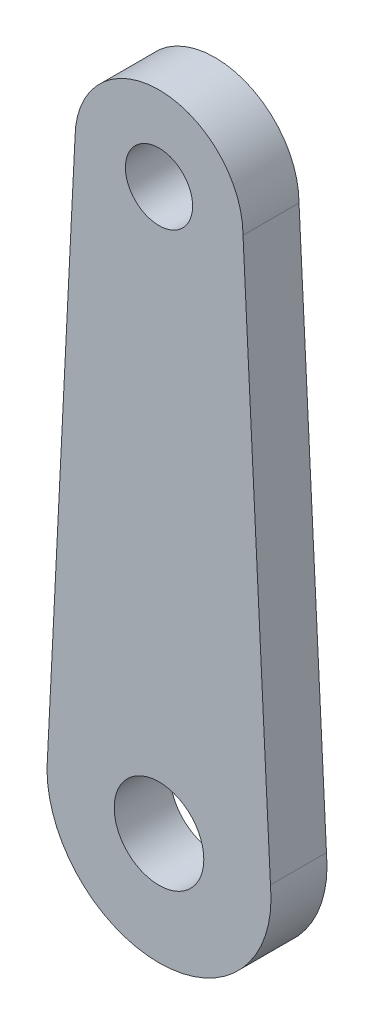
ISO-10303-21;
HEADER;
FILE_DESCRIPTION(('STEP AP214'),'2;1');
FILE_NAME('part.step','',(''),(''),'','','');
FILE_SCHEMA(('AUTOMOTIVE_DESIGN { 1 0 10303 214 1 1 1 1 }'));
ENDSEC;
DATA;
#1=APPLICATION_CONTEXT('core data for automotive mechanical design processes');
#2=APPLICATION_PROTOCOL_DEFINITION('international standard','automotive_design',2000,#1);
#3=PRODUCT_CONTEXT('',#1,'mechanical');
#4=PRODUCT('Part','Part','',(#3));
#5=PRODUCT_RELATED_PRODUCT_CATEGORY('part','',(#4));
#6=PRODUCT_DEFINITION_FORMATION('','',#4);
#7=PRODUCT_DEFINITION_CONTEXT('part definition',#1,'design');
#8=PRODUCT_DEFINITION('design','',#6,#7);
#9=PRODUCT_DEFINITION_SHAPE('','',#8);
#10=(LENGTH_UNIT() NAMED_UNIT(*) SI_UNIT(.MILLI.,.METRE.));
#11=(NAMED_UNIT(*) PLANE_ANGLE_UNIT() SI_UNIT($,.RADIAN.));
#12=(NAMED_UNIT(*) SI_UNIT($,.STERADIAN.) SOLID_ANGLE_UNIT());
#13=UNCERTAINTY_MEASURE_WITH_UNIT(LENGTH_MEASURE(1.E-05),#10,'distance_accuracy_value','');
#14=(GEOMETRIC_REPRESENTATION_CONTEXT(3) GLOBAL_UNCERTAINTY_ASSIGNED_CONTEXT((#13)) GLOBAL_UNIT_ASSIGNED_CONTEXT((#10,
#11,#12)) REPRESENTATION_CONTEXT('',''));
#15=CARTESIAN_POINT('',(0.,0.,0.));
#16=DIRECTION('',(0.,0.,1.));
#17=DIRECTION('',(1.,0.,0.));
#18=AXIS2_PLACEMENT_3D('',#15,#16,#17);
#19=CARTESIAN_POINT('',(0.,0.,5.));
#20=DIRECTION('',(0.,0.,1.));
#21=DIRECTION('',(1.,0.,0.));
#22=AXIS2_PLACEMENT_3D('',#19,#20,#21);
#23=PLANE('',#22);
#24=CARTESIAN_POINT('',(0.,0.,5.));
#25=DIRECTION('',(0.,0.,1.));
#26=DIRECTION('',(1.,0.,0.));
#27=AXIS2_PLACEMENT_3D('',#24,#25,#26);
#28=CIRCLE('',#27,4.);
#29=CARTESIAN_POINT('',(4.,0.,5.));
#30=VERTEX_POINT('',#29);
#31=EDGE_CURVE('E98',#30,#30,#28,.T.);
#32=ORIENTED_EDGE('',*,*,#31,.F.);
#33=EDGE_LOOP('',(#32));
#34=FACE_BOUND('',#33,.T.);
#35=CARTESIAN_POINT('',(0.,0.,5.));
#36=DIRECTION('',(0.,0.,1.));
#37=DIRECTION('',(1.,0.,0.));
#38=AXIS2_PLACEMENT_3D('',#35,#36,#37);
#39=CIRCLE('',#38,10.);
#40=CARTESIAN_POINT('',(-9.9501246882793,0.997506234414005,5.));
#41=VERTEX_POINT('',#40);
#42=CARTESIAN_POINT('',(9.9501246882793,0.997506234414005,5.));
#43=VERTEX_POINT('',#42);
#44=EDGE_CURVE('E83',#41,#43,#39,.T.);
#45=ORIENTED_EDGE('',*,*,#44,.T.);
#46=DIRECTION('',(-0.0499376169438923,0.998752338877845,0.));
#47=VECTOR('',#46,1.);
#48=CARTESIAN_POINT('',(7.49999999999999,50.,5.));
#49=LINE('',#48,#47);
#50=CARTESIAN_POINT('',(7.49999999999999,50.,5.));
#51=VERTEX_POINT('',#50);
#52=EDGE_CURVE('E78',#43,#51,#49,.T.);
#53=ORIENTED_EDGE('',*,*,#52,.T.);
#54=CARTESIAN_POINT('',(0.,50.,5.));
#55=DIRECTION('',(0.,0.,1.));
#56=DIRECTION('',(1.,0.,0.));
#57=AXIS2_PLACEMENT_3D('',#54,#55,#56);
#58=CIRCLE('',#57,7.49999999999999);
#59=CARTESIAN_POINT('',(-7.49999999999999,50.,5.));
#60=VERTEX_POINT('',#59);
#61=EDGE_CURVE('E81',#51,#60,#58,.T.);
#62=ORIENTED_EDGE('',*,*,#61,.T.);
#63=DIRECTION('',(-0.0499376169438923,-0.998752338877845,0.));
#64=VECTOR('',#63,1.);
#65=CARTESIAN_POINT('',(-7.49999999999999,50.,5.));
#66=LINE('',#65,#64);
#67=EDGE_CURVE('E48',#60,#41,#66,.T.);
#68=ORIENTED_EDGE('',*,*,#67,.T.);
#69=EDGE_LOOP('',(#45,#53,#62,#68));
#70=FACE_BOUND('',#69,.T.);
#71=CARTESIAN_POINT('',(0.,50.,5.));
#72=DIRECTION('',(0.,0.,1.));
#73=DIRECTION('',(1.,0.,0.));
#74=AXIS2_PLACEMENT_3D('',#71,#72,#73);
#75=CIRCLE('',#74,3.);
#76=CARTESIAN_POINT('',(3.,50.,5.));
#77=VERTEX_POINT('',#76);
#78=EDGE_CURVE('E113',#77,#77,#75,.T.);
#79=ORIENTED_EDGE('',*,*,#78,.F.);
#80=EDGE_LOOP('',(#79));
#81=FACE_BOUND('',#80,.T.);
#82=ADVANCED_FACE('F31',(#34,#70,#81),#23,.T.);
#83=CARTESIAN_POINT('',(0.,0.,0.));
#84=DIRECTION('',(0.,0.,1.));
#85=DIRECTION('',(1.,0.,0.));
#86=AXIS2_PLACEMENT_3D('',#83,#84,#85);
#87=PLANE('',#86);
#88=CARTESIAN_POINT('',(0.,0.,0.));
#89=DIRECTION('',(0.,0.,1.));
#90=DIRECTION('',(1.,0.,0.));
#91=AXIS2_PLACEMENT_3D('',#88,#89,#90);
#92=CIRCLE('',#91,4.);
#93=CARTESIAN_POINT('',(4.,0.,0.));
#94=VERTEX_POINT('',#93);
#95=EDGE_CURVE('E110',#94,#94,#92,.T.);
#96=ORIENTED_EDGE('',*,*,#95,.T.);
#97=EDGE_LOOP('',(#96));
#98=FACE_BOUND('',#97,.T.);
#99=CARTESIAN_POINT('',(0.,0.,0.));
#100=DIRECTION('',(0.,0.,1.));
#101=DIRECTION('',(1.,0.,0.));
#102=AXIS2_PLACEMENT_3D('',#99,#100,#101);
#103=CIRCLE('',#102,10.);
#104=CARTESIAN_POINT('',(-9.9501246882793,0.997506234414005,0.));
#105=VERTEX_POINT('',#104);
#106=CARTESIAN_POINT('',(9.9501246882793,0.997506234414005,0.));
#107=VERTEX_POINT('',#106);
#108=EDGE_CURVE('E95',#105,#107,#103,.T.);
#109=ORIENTED_EDGE('',*,*,#108,.F.);
#110=DIRECTION('',(-0.0499376169438923,-0.998752338877845,0.));
#111=VECTOR('',#110,1.);
#112=CARTESIAN_POINT('',(-7.49999999999999,50.,0.));
#113=LINE('',#112,#111);
#114=CARTESIAN_POINT('',(-7.49999999999999,50.,0.));
#115=VERTEX_POINT('',#114);
#116=EDGE_CURVE('E71',#115,#105,#113,.T.);
#117=ORIENTED_EDGE('',*,*,#116,.F.);
#118=CARTESIAN_POINT('',(0.,50.,0.));
#119=DIRECTION('',(0.,0.,1.));
#120=DIRECTION('',(1.,0.,0.));
#121=AXIS2_PLACEMENT_3D('',#118,#119,#120);
#122=CIRCLE('',#121,7.49999999999999);
#123=CARTESIAN_POINT('',(7.49999999999999,50.,0.));
#124=VERTEX_POINT('',#123);
#125=EDGE_CURVE('E65',#124,#115,#122,.T.);
#126=ORIENTED_EDGE('',*,*,#125,.F.);
#127=DIRECTION('',(-0.0499376169438923,0.998752338877845,0.));
#128=VECTOR('',#127,1.);
#129=CARTESIAN_POINT('',(7.49999999999999,50.,0.));
#130=LINE('',#129,#128);
#131=EDGE_CURVE('E87',#107,#124,#130,.T.);
#132=ORIENTED_EDGE('',*,*,#131,.F.);
#133=EDGE_LOOP('',(#109,#117,#126,#132));
#134=FACE_BOUND('',#133,.T.);
#135=CARTESIAN_POINT('',(0.,50.,0.));
#136=DIRECTION('',(0.,0.,1.));
#137=DIRECTION('',(1.,0.,0.));
#138=AXIS2_PLACEMENT_3D('',#135,#136,#137);
#139=CIRCLE('',#138,3.);
#140=CARTESIAN_POINT('',(3.,50.,0.));
#141=VERTEX_POINT('',#140);
#142=EDGE_CURVE('E116',#141,#141,#139,.T.);
#143=ORIENTED_EDGE('',*,*,#142,.T.);
#144=EDGE_LOOP('',(#143));
#145=FACE_BOUND('',#144,.T.);
#146=ADVANCED_FACE('F106',(#98,#134,#145),#87,.F.);
#147=CARTESIAN_POINT('',(0.,0.,5.));
#148=DIRECTION('',(0.,0.,-1.));
#149=DIRECTION('',(-1.,0.,0.));
#150=AXIS2_PLACEMENT_3D('',#147,#148,#149);
#151=CYLINDRICAL_SURFACE('',#150,10.);
#152=ORIENTED_EDGE('',*,*,#108,.T.);
#153=DIRECTION('',(0.,0.,-1.));
#154=VECTOR('',#153,1.);
#155=CARTESIAN_POINT('',(9.9501246882793,0.997506234414005,5.));
#156=LINE('',#155,#154);
#157=EDGE_CURVE('E11',#43,#107,#156,.T.);
#158=ORIENTED_EDGE('',*,*,#157,.F.);
#159=ORIENTED_EDGE('',*,*,#44,.F.);
#160=DIRECTION('',(0.,0.,-1.));
#161=VECTOR('',#160,1.);
#162=CARTESIAN_POINT('',(-9.9501246882793,0.997506234414005,5.));
#163=LINE('',#162,#161);
#164=EDGE_CURVE('E91',#41,#105,#163,.T.);
#165=ORIENTED_EDGE('',*,*,#164,.T.);
#166=EDGE_LOOP('',(#152,#158,#159,#165));
#167=FACE_BOUND('',#166,.T.);
#168=ADVANCED_FACE('F33',(#167),#151,.T.);
#169=CARTESIAN_POINT('',(7.49999999999999,50.,5.));
#170=DIRECTION('',(-0.998752338877845,-0.0499376169438923,0.));
#171=DIRECTION('',(0.0499376169438923,-0.998752338877845,0.));
#172=AXIS2_PLACEMENT_3D('',#169,#170,#171);
#173=PLANE('',#172);
#174=ORIENTED_EDGE('',*,*,#131,.T.);
#175=DIRECTION('',(0.,0.,-1.));
#176=VECTOR('',#175,1.);
#177=CARTESIAN_POINT('',(7.49999999999999,50.,5.));
#178=LINE('',#177,#176);
#179=EDGE_CURVE('E40',#51,#124,#178,.T.);
#180=ORIENTED_EDGE('',*,*,#179,.F.);
#181=ORIENTED_EDGE('',*,*,#52,.F.);
#182=ORIENTED_EDGE('',*,*,#157,.T.);
#183=EDGE_LOOP('',(#174,#180,#181,#182));
#184=FACE_BOUND('',#183,.T.);
#185=ADVANCED_FACE('F86',(#184),#173,.F.);
#186=CARTESIAN_POINT('',(0.,50.,5.));
#187=DIRECTION('',(0.,0.,-1.));
#188=DIRECTION('',(-1.,0.,0.));
#189=AXIS2_PLACEMENT_3D('',#186,#187,#188);
#190=CYLINDRICAL_SURFACE('',#189,7.49999999999999);
#191=ORIENTED_EDGE('',*,*,#125,.T.);
#192=DIRECTION('',(0.,0.,-1.));
#193=VECTOR('',#192,1.);
#194=CARTESIAN_POINT('',(-7.49999999999999,50.,5.));
#195=LINE('',#194,#193);
#196=EDGE_CURVE('E88',#60,#115,#195,.T.);
#197=ORIENTED_EDGE('',*,*,#196,.F.);
#198=ORIENTED_EDGE('',*,*,#61,.F.);
#199=ORIENTED_EDGE('',*,*,#179,.T.);
#200=EDGE_LOOP('',(#191,#197,#198,#199));
#201=FACE_BOUND('',#200,.T.);
#202=ADVANCED_FACE('F89',(#201),#190,.T.);
#203=CARTESIAN_POINT('',(-7.49999999999999,50.,5.));
#204=DIRECTION('',(0.998752338877845,-0.0499376169438923,0.));
#205=DIRECTION('',(0.0499376169438923,0.998752338877845,0.));
#206=AXIS2_PLACEMENT_3D('',#203,#204,#205);
#207=PLANE('',#206);
#208=ORIENTED_EDGE('',*,*,#116,.T.);
#209=ORIENTED_EDGE('',*,*,#164,.F.);
#210=ORIENTED_EDGE('',*,*,#67,.F.);
#211=ORIENTED_EDGE('',*,*,#196,.T.);
#212=EDGE_LOOP('',(#208,#209,#210,#211));
#213=FACE_BOUND('',#212,.T.);
#214=ADVANCED_FACE('F103',(#213),#207,.F.);
#215=CARTESIAN_POINT('',(0.,0.,5.));
#216=DIRECTION('',(0.,0.,-1.));
#217=DIRECTION('',(-1.,0.,0.));
#218=AXIS2_PLACEMENT_3D('',#215,#216,#217);
#219=CYLINDRICAL_SURFACE('',#218,4.);
#220=ORIENTED_EDGE('',*,*,#31,.T.);
#221=EDGE_LOOP('',(#220));
#222=FACE_BOUND('',#221,.T.);
#223=ORIENTED_EDGE('',*,*,#95,.F.);
#224=EDGE_LOOP('',(#223));
#225=FACE_BOUND('',#224,.T.);
#226=ADVANCED_FACE('F134',(#222,#225),#219,.F.);
#227=CARTESIAN_POINT('',(0.,50.,5.));
#228=DIRECTION('',(0.,0.,-1.));
#229=DIRECTION('',(-1.,0.,0.));
#230=AXIS2_PLACEMENT_3D('',#227,#228,#229);
#231=CYLINDRICAL_SURFACE('',#230,3.);
#232=ORIENTED_EDGE('',*,*,#78,.T.);
#233=EDGE_LOOP('',(#232));
#234=FACE_BOUND('',#233,.T.);
#235=ORIENTED_EDGE('',*,*,#142,.F.);
#236=EDGE_LOOP('',(#235));
#237=FACE_BOUND('',#236,.T.);
#238=ADVANCED_FACE('F122',(#234,#237),#231,.F.);
#239=CLOSED_SHELL('',(#82,#146,#168,#185,#202,#214,#226,#238));
#240=MANIFOLD_SOLID_BREP('B2',#239);
#241=ADVANCED_BREP_SHAPE_REPRESENTATION('',(#18,#240),#14);
#242=SHAPE_DEFINITION_REPRESENTATION(#9,#241);
ENDSEC;
END-ISO-10303-21;
